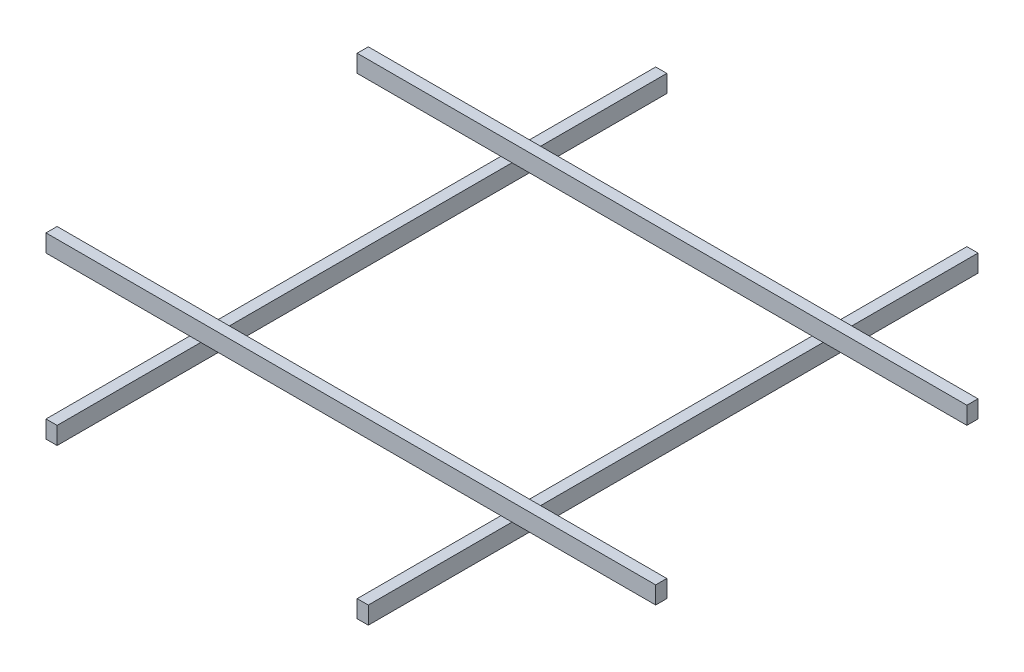
ISO-10303-21;
HEADER;
FILE_DESCRIPTION(('STEP AP214'),'2;1');
FILE_NAME('part.step','',(''),(''),'','','');
FILE_SCHEMA(('AUTOMOTIVE_DESIGN { 1 0 10303 214 1 1 1 1 }'));
ENDSEC;
DATA;
#1=APPLICATION_CONTEXT('core data for automotive mechanical design processes');
#2=APPLICATION_PROTOCOL_DEFINITION('international standard','automotive_design',2000,#1);
#3=PRODUCT_CONTEXT('',#1,'mechanical');
#4=PRODUCT('Part','Part','',(#3));
#5=PRODUCT_RELATED_PRODUCT_CATEGORY('part','',(#4));
#6=PRODUCT_DEFINITION_FORMATION('','',#4);
#7=PRODUCT_DEFINITION_CONTEXT('part definition',#1,'design');
#8=PRODUCT_DEFINITION('design','',#6,#7);
#9=PRODUCT_DEFINITION_SHAPE('','',#8);
#10=(LENGTH_UNIT() NAMED_UNIT(*) SI_UNIT(.MILLI.,.METRE.));
#11=(NAMED_UNIT(*) PLANE_ANGLE_UNIT() SI_UNIT($,.RADIAN.));
#12=(NAMED_UNIT(*) SI_UNIT($,.STERADIAN.) SOLID_ANGLE_UNIT());
#13=UNCERTAINTY_MEASURE_WITH_UNIT(LENGTH_MEASURE(1.E-05),#10,'distance_accuracy_value','');
#14=(GEOMETRIC_REPRESENTATION_CONTEXT(3) GLOBAL_UNCERTAINTY_ASSIGNED_CONTEXT((#13)) GLOBAL_UNIT_ASSIGNED_CONTEXT((#10,
#11,#12)) REPRESENTATION_CONTEXT('',''));
#15=CARTESIAN_POINT('',(0.,0.,0.));
#16=DIRECTION('',(0.,0.,1.));
#17=DIRECTION('',(1.,0.,0.));
#18=AXIS2_PLACEMENT_3D('',#15,#16,#17);
#19=CARTESIAN_POINT('',(4572.,209.55,-1238.25));
#20=DIRECTION('',(0.,0.,1.));
#21=DIRECTION('',(1.,0.,0.));
#22=AXIS2_PLACEMENT_3D('',#19,#20,#21);
#23=PLANE('',#22);
#24=DIRECTION('',(0.,1.,0.));
#25=VECTOR('',#24,1.);
#26=CARTESIAN_POINT('',(-304.8,209.55,-1238.25));
#27=LINE('',#26,#25);
#28=CARTESIAN_POINT('',(-304.8,69.85,-1238.25));
#29=VERTEX_POINT('',#28);
#30=CARTESIAN_POINT('',(-304.8,209.55,-1238.25));
#31=VERTEX_POINT('',#30);
#32=EDGE_CURVE('E130',#29,#31,#27,.T.);
#33=ORIENTED_EDGE('',*,*,#32,.T.);
#34=DIRECTION('',(-1.,0.,0.));
#35=VECTOR('',#34,1.);
#36=CARTESIAN_POINT('',(4572.,209.55,-1238.25));
#37=LINE('',#36,#35);
#38=CARTESIAN_POINT('',(4572.,209.55,-1238.25));
#39=VERTEX_POINT('',#38);
#40=EDGE_CURVE('E13',#39,#31,#37,.T.);
#41=ORIENTED_EDGE('',*,*,#40,.F.);
#42=DIRECTION('',(0.,1.,0.));
#43=VECTOR('',#42,1.);
#44=CARTESIAN_POINT('',(4572.,209.55,-1238.25));
#45=LINE('',#44,#43);
#46=CARTESIAN_POINT('',(4572.,69.85,-1238.25));
#47=VERTEX_POINT('',#46);
#48=EDGE_CURVE('E117',#47,#39,#45,.T.);
#49=ORIENTED_EDGE('',*,*,#48,.F.);
#50=DIRECTION('',(-1.,0.,0.));
#51=VECTOR('',#50,1.);
#52=CARTESIAN_POINT('',(4572.,69.85,-1238.25));
#53=LINE('',#52,#51);
#54=EDGE_CURVE('E126',#47,#29,#53,.T.);
#55=ORIENTED_EDGE('',*,*,#54,.T.);
#56=EDGE_LOOP('',(#33,#41,#49,#55));
#57=FACE_BOUND('',#56,.T.);
#58=ADVANCED_FACE('F65',(#57),#23,.F.);
#59=CARTESIAN_POINT('',(4572.,209.55,-1149.35));
#60=DIRECTION('',(0.,-1.,0.));
#61=DIRECTION('',(0.,0.,-1.));
#62=AXIS2_PLACEMENT_3D('',#59,#60,#61);
#63=PLANE('',#62);
#64=DIRECTION('',(0.,0.,1.));
#65=VECTOR('',#64,1.);
#66=CARTESIAN_POINT('',(-304.8,209.55,-1149.35));
#67=LINE('',#66,#65);
#68=CARTESIAN_POINT('',(-304.8,209.55,-1149.35));
#69=VERTEX_POINT('',#68);
#70=EDGE_CURVE('E121',#31,#69,#67,.T.);
#71=ORIENTED_EDGE('',*,*,#70,.T.);
#72=DIRECTION('',(-1.,0.,0.));
#73=VECTOR('',#72,1.);
#74=CARTESIAN_POINT('',(4572.,209.55,-1149.35));
#75=LINE('',#74,#73);
#76=CARTESIAN_POINT('',(4572.,209.55,-1149.35));
#77=VERTEX_POINT('',#76);
#78=EDGE_CURVE('E74',#77,#69,#75,.T.);
#79=ORIENTED_EDGE('',*,*,#78,.F.);
#80=DIRECTION('',(0.,0.,1.));
#81=VECTOR('',#80,1.);
#82=CARTESIAN_POINT('',(4572.,209.55,-1149.35));
#83=LINE('',#82,#81);
#84=EDGE_CURVE('E112',#39,#77,#83,.T.);
#85=ORIENTED_EDGE('',*,*,#84,.F.);
#86=ORIENTED_EDGE('',*,*,#40,.T.);
#87=EDGE_LOOP('',(#71,#79,#85,#86));
#88=FACE_BOUND('',#87,.T.);
#89=ADVANCED_FACE('F120',(#88),#63,.F.);
#90=CARTESIAN_POINT('',(4572.,209.55,-1149.35));
#91=DIRECTION('',(0.,0.,-1.));
#92=DIRECTION('',(-1.,0.,0.));
#93=AXIS2_PLACEMENT_3D('',#90,#91,#92);
#94=PLANE('',#93);
#95=DIRECTION('',(0.,-1.,0.));
#96=VECTOR('',#95,1.);
#97=CARTESIAN_POINT('',(-304.8,209.55,-1149.35));
#98=LINE('',#97,#96);
#99=CARTESIAN_POINT('',(-304.8,69.85,-1149.35));
#100=VERTEX_POINT('',#99);
#101=EDGE_CURVE('E99',#69,#100,#98,.T.);
#102=ORIENTED_EDGE('',*,*,#101,.T.);
#103=DIRECTION('',(-1.,0.,0.));
#104=VECTOR('',#103,1.);
#105=CARTESIAN_POINT('',(4572.,69.85,-1149.35));
#106=LINE('',#105,#104);
#107=CARTESIAN_POINT('',(4572.,69.85,-1149.35));
#108=VERTEX_POINT('',#107);
#109=EDGE_CURVE('E123',#108,#100,#106,.T.);
#110=ORIENTED_EDGE('',*,*,#109,.F.);
#111=DIRECTION('',(0.,-1.,0.));
#112=VECTOR('',#111,1.);
#113=CARTESIAN_POINT('',(4572.,209.55,-1149.35));
#114=LINE('',#113,#112);
#115=EDGE_CURVE('E115',#77,#108,#114,.T.);
#116=ORIENTED_EDGE('',*,*,#115,.F.);
#117=ORIENTED_EDGE('',*,*,#78,.T.);
#118=EDGE_LOOP('',(#102,#110,#116,#117));
#119=FACE_BOUND('',#118,.T.);
#120=ADVANCED_FACE('F124',(#119),#94,.F.);
#121=CARTESIAN_POINT('',(4572.,69.85,-1149.35));
#122=DIRECTION('',(0.,1.,0.));
#123=DIRECTION('',(0.,0.,1.));
#124=AXIS2_PLACEMENT_3D('',#121,#122,#123);
#125=PLANE('',#124);
#126=DIRECTION('',(0.,0.,-1.));
#127=VECTOR('',#126,1.);
#128=CARTESIAN_POINT('',(-304.8,69.85,-1149.35));
#129=LINE('',#128,#127);
#130=EDGE_CURVE('E105',#100,#29,#129,.T.);
#131=ORIENTED_EDGE('',*,*,#130,.T.);
#132=ORIENTED_EDGE('',*,*,#54,.F.);
#133=DIRECTION('',(0.,0.,-1.));
#134=VECTOR('',#133,1.);
#135=CARTESIAN_POINT('',(4572.,69.85,-1149.35));
#136=LINE('',#135,#134);
#137=EDGE_CURVE('E82',#108,#47,#136,.T.);
#138=ORIENTED_EDGE('',*,*,#137,.F.);
#139=ORIENTED_EDGE('',*,*,#109,.T.);
#140=EDGE_LOOP('',(#131,#132,#138,#139));
#141=FACE_BOUND('',#140,.T.);
#142=ADVANCED_FACE('F137',(#141),#125,.F.);
#143=CARTESIAN_POINT('',(4572.,139.7,-2082.8));
#144=DIRECTION('',(1.,0.,0.));
#145=DIRECTION('',(0.,0.,-1.));
#146=AXIS2_PLACEMENT_3D('',#143,#144,#145);
#147=PLANE('',#146);
#148=ORIENTED_EDGE('',*,*,#48,.T.);
#149=ORIENTED_EDGE('',*,*,#84,.T.);
#150=ORIENTED_EDGE('',*,*,#115,.T.);
#151=ORIENTED_EDGE('',*,*,#137,.T.);
#152=EDGE_LOOP('',(#148,#149,#150,#151));
#153=FACE_BOUND('',#152,.T.);
#154=ADVANCED_FACE('F113',(#153),#147,.T.);
#155=CARTESIAN_POINT('',(-304.8,139.7,-2082.8));
#156=DIRECTION('',(1.,0.,0.));
#157=DIRECTION('',(0.,0.,-1.));
#158=AXIS2_PLACEMENT_3D('',#155,#156,#157);
#159=PLANE('',#158);
#160=ORIENTED_EDGE('',*,*,#32,.F.);
#161=ORIENTED_EDGE('',*,*,#130,.F.);
#162=ORIENTED_EDGE('',*,*,#101,.F.);
#163=ORIENTED_EDGE('',*,*,#70,.F.);
#164=EDGE_LOOP('',(#160,#161,#162,#163));
#165=FACE_BOUND('',#164,.T.);
#166=ADVANCED_FACE('F140',(#165),#159,.F.);
#167=CLOSED_SHELL('',(#58,#89,#120,#142,#154,#166));
#168=MANIFOLD_SOLID_BREP('B2',#167);
#169=CARTESIAN_POINT('',(4572.,209.55,-3727.45));
#170=DIRECTION('',(0.,0.,1.));
#171=DIRECTION('',(1.,0.,0.));
#172=AXIS2_PLACEMENT_3D('',#169,#170,#171);
#173=PLANE('',#172);
#174=DIRECTION('',(0.,1.,0.));
#175=VECTOR('',#174,1.);
#176=CARTESIAN_POINT('',(-304.8,209.55,-3727.45));
#177=LINE('',#176,#175);
#178=CARTESIAN_POINT('',(-304.8,69.85,-3727.45));
#179=VERTEX_POINT('',#178);
#180=CARTESIAN_POINT('',(-304.8,209.55,-3727.45));
#181=VERTEX_POINT('',#180);
#182=EDGE_CURVE('E289',#179,#181,#177,.T.);
#183=ORIENTED_EDGE('',*,*,#182,.T.);
#184=DIRECTION('',(-1.,0.,0.));
#185=VECTOR('',#184,1.);
#186=CARTESIAN_POINT('',(4572.,209.55,-3727.45));
#187=LINE('',#186,#185);
#188=CARTESIAN_POINT('',(4572.,209.55,-3727.45));
#189=VERTEX_POINT('',#188);
#190=EDGE_CURVE('E63',#189,#181,#187,.T.);
#191=ORIENTED_EDGE('',*,*,#190,.F.);
#192=DIRECTION('',(0.,1.,0.));
#193=VECTOR('',#192,1.);
#194=CARTESIAN_POINT('',(4572.,209.55,-3727.45));
#195=LINE('',#194,#193);
#196=CARTESIAN_POINT('',(4572.,69.85,-3727.45));
#197=VERTEX_POINT('',#196);
#198=EDGE_CURVE('E276',#197,#189,#195,.T.);
#199=ORIENTED_EDGE('',*,*,#198,.F.);
#200=DIRECTION('',(-1.,0.,0.));
#201=VECTOR('',#200,1.);
#202=CARTESIAN_POINT('',(4572.,69.85,-3727.45));
#203=LINE('',#202,#201);
#204=EDGE_CURVE('E285',#197,#179,#203,.T.);
#205=ORIENTED_EDGE('',*,*,#204,.T.);
#206=EDGE_LOOP('',(#183,#191,#199,#205));
#207=FACE_BOUND('',#206,.T.);
#208=ADVANCED_FACE('F224',(#207),#173,.F.);
#209=CARTESIAN_POINT('',(4572.,209.55,-3638.55));
#210=DIRECTION('',(0.,-1.,0.));
#211=DIRECTION('',(0.,0.,-1.));
#212=AXIS2_PLACEMENT_3D('',#209,#210,#211);
#213=PLANE('',#212);
#214=DIRECTION('',(0.,0.,1.));
#215=VECTOR('',#214,1.);
#216=CARTESIAN_POINT('',(-304.8,209.55,-3638.55));
#217=LINE('',#216,#215);
#218=CARTESIAN_POINT('',(-304.8,209.55,-3638.55));
#219=VERTEX_POINT('',#218);
#220=EDGE_CURVE('E280',#181,#219,#217,.T.);
#221=ORIENTED_EDGE('',*,*,#220,.T.);
#222=DIRECTION('',(-1.,0.,0.));
#223=VECTOR('',#222,1.);
#224=CARTESIAN_POINT('',(4572.,209.55,-3638.55));
#225=LINE('',#224,#223);
#226=CARTESIAN_POINT('',(4572.,209.55,-3638.55));
#227=VERTEX_POINT('',#226);
#228=EDGE_CURVE('E233',#227,#219,#225,.T.);
#229=ORIENTED_EDGE('',*,*,#228,.F.);
#230=DIRECTION('',(0.,0.,1.));
#231=VECTOR('',#230,1.);
#232=CARTESIAN_POINT('',(4572.,209.55,-3638.55));
#233=LINE('',#232,#231);
#234=EDGE_CURVE('E271',#189,#227,#233,.T.);
#235=ORIENTED_EDGE('',*,*,#234,.F.);
#236=ORIENTED_EDGE('',*,*,#190,.T.);
#237=EDGE_LOOP('',(#221,#229,#235,#236));
#238=FACE_BOUND('',#237,.T.);
#239=ADVANCED_FACE('F279',(#238),#213,.F.);
#240=CARTESIAN_POINT('',(4572.,209.55,-3638.55));
#241=DIRECTION('',(0.,0.,-1.));
#242=DIRECTION('',(-1.,0.,0.));
#243=AXIS2_PLACEMENT_3D('',#240,#241,#242);
#244=PLANE('',#243);
#245=DIRECTION('',(0.,-1.,0.));
#246=VECTOR('',#245,1.);
#247=CARTESIAN_POINT('',(-304.8,209.55,-3638.55));
#248=LINE('',#247,#246);
#249=CARTESIAN_POINT('',(-304.8,69.85,-3638.55));
#250=VERTEX_POINT('',#249);
#251=EDGE_CURVE('E258',#219,#250,#248,.T.);
#252=ORIENTED_EDGE('',*,*,#251,.T.);
#253=DIRECTION('',(-1.,0.,0.));
#254=VECTOR('',#253,1.);
#255=CARTESIAN_POINT('',(4572.,69.85,-3638.55));
#256=LINE('',#255,#254);
#257=CARTESIAN_POINT('',(4572.,69.85,-3638.55));
#258=VERTEX_POINT('',#257);
#259=EDGE_CURVE('E282',#258,#250,#256,.T.);
#260=ORIENTED_EDGE('',*,*,#259,.F.);
#261=DIRECTION('',(0.,-1.,0.));
#262=VECTOR('',#261,1.);
#263=CARTESIAN_POINT('',(4572.,209.55,-3638.55));
#264=LINE('',#263,#262);
#265=EDGE_CURVE('E274',#227,#258,#264,.T.);
#266=ORIENTED_EDGE('',*,*,#265,.F.);
#267=ORIENTED_EDGE('',*,*,#228,.T.);
#268=EDGE_LOOP('',(#252,#260,#266,#267));
#269=FACE_BOUND('',#268,.T.);
#270=ADVANCED_FACE('F283',(#269),#244,.F.);
#271=CARTESIAN_POINT('',(4572.,69.85,-3638.55));
#272=DIRECTION('',(0.,1.,0.));
#273=DIRECTION('',(0.,0.,1.));
#274=AXIS2_PLACEMENT_3D('',#271,#272,#273);
#275=PLANE('',#274);
#276=DIRECTION('',(0.,0.,-1.));
#277=VECTOR('',#276,1.);
#278=CARTESIAN_POINT('',(-304.8,69.85,-3638.55));
#279=LINE('',#278,#277);
#280=EDGE_CURVE('E264',#250,#179,#279,.T.);
#281=ORIENTED_EDGE('',*,*,#280,.T.);
#282=ORIENTED_EDGE('',*,*,#204,.F.);
#283=DIRECTION('',(0.,0.,-1.));
#284=VECTOR('',#283,1.);
#285=CARTESIAN_POINT('',(4572.,69.85,-3638.55));
#286=LINE('',#285,#284);
#287=EDGE_CURVE('E241',#258,#197,#286,.T.);
#288=ORIENTED_EDGE('',*,*,#287,.F.);
#289=ORIENTED_EDGE('',*,*,#259,.T.);
#290=EDGE_LOOP('',(#281,#282,#288,#289));
#291=FACE_BOUND('',#290,.T.);
#292=ADVANCED_FACE('F298',(#291),#275,.F.);
#293=CARTESIAN_POINT('',(4572.,139.7,-4572.));
#294=DIRECTION('',(1.,0.,0.));
#295=DIRECTION('',(0.,0.,-1.));
#296=AXIS2_PLACEMENT_3D('',#293,#294,#295);
#297=PLANE('',#296);
#298=ORIENTED_EDGE('',*,*,#198,.T.);
#299=ORIENTED_EDGE('',*,*,#234,.T.);
#300=ORIENTED_EDGE('',*,*,#265,.T.);
#301=ORIENTED_EDGE('',*,*,#287,.T.);
#302=EDGE_LOOP('',(#298,#299,#300,#301));
#303=FACE_BOUND('',#302,.T.);
#304=ADVANCED_FACE('F272',(#303),#297,.T.);
#305=CARTESIAN_POINT('',(-304.8,139.7,-4572.));
#306=DIRECTION('',(1.,0.,0.));
#307=DIRECTION('',(0.,0.,-1.));
#308=AXIS2_PLACEMENT_3D('',#305,#306,#307);
#309=PLANE('',#308);
#310=ORIENTED_EDGE('',*,*,#182,.F.);
#311=ORIENTED_EDGE('',*,*,#280,.F.);
#312=ORIENTED_EDGE('',*,*,#251,.F.);
#313=ORIENTED_EDGE('',*,*,#220,.F.);
#314=EDGE_LOOP('',(#310,#311,#312,#313));
#315=FACE_BOUND('',#314,.T.);
#316=ADVANCED_FACE('F301',(#315),#309,.F.);
#317=CLOSED_SHELL('',(#208,#239,#270,#292,#304,#316));
#318=MANIFOLD_SOLID_BREP('B7',#317);
#319=CARTESIAN_POINT('',(3333.75,69.85,-4876.8));
#320=DIRECTION('',(1.,0.,0.));
#321=DIRECTION('',(0.,0.,-1.));
#322=AXIS2_PLACEMENT_3D('',#319,#320,#321);
#323=PLANE('',#322);
#324=DIRECTION('',(0.,1.,0.));
#325=VECTOR('',#324,1.);
#326=CARTESIAN_POINT('',(3333.75,69.85,1.63306650666299E-13));
#327=LINE('',#326,#325);
#328=CARTESIAN_POINT('',(3333.75,-69.85,1.63306650666299E-13));
#329=VERTEX_POINT('',#328);
#330=CARTESIAN_POINT('',(3333.75,69.85,1.63306650666299E-13));
#331=VERTEX_POINT('',#330);
#332=EDGE_CURVE('E447',#329,#331,#327,.T.);
#333=ORIENTED_EDGE('',*,*,#332,.T.);
#334=DIRECTION('',(0.,0.,1.));
#335=VECTOR('',#334,1.);
#336=CARTESIAN_POINT('',(3333.75,69.85,-4876.8));
#337=LINE('',#336,#335);
#338=CARTESIAN_POINT('',(3333.75,69.85,-4876.8));
#339=VERTEX_POINT('',#338);
#340=EDGE_CURVE('E222',#339,#331,#337,.T.);
#341=ORIENTED_EDGE('',*,*,#340,.F.);
#342=DIRECTION('',(0.,1.,0.));
#343=VECTOR('',#342,1.);
#344=CARTESIAN_POINT('',(3333.75,69.85,-4876.8));
#345=LINE('',#344,#343);
#346=CARTESIAN_POINT('',(3333.75,-69.85,-4876.8));
#347=VERTEX_POINT('',#346);
#348=EDGE_CURVE('E435',#347,#339,#345,.T.);
#349=ORIENTED_EDGE('',*,*,#348,.F.);
#350=DIRECTION('',(0.,0.,1.));
#351=VECTOR('',#350,1.);
#352=CARTESIAN_POINT('',(3333.75,-69.85,-4876.8));
#353=LINE('',#352,#351);
#354=EDGE_CURVE('E443',#347,#329,#353,.T.);
#355=ORIENTED_EDGE('',*,*,#354,.T.);
#356=EDGE_LOOP('',(#333,#341,#349,#355));
#357=FACE_BOUND('',#356,.T.);
#358=ADVANCED_FACE('F384',(#357),#323,.F.);
#359=CARTESIAN_POINT('',(3422.65,69.85,-4876.8));
#360=DIRECTION('',(0.,-1.,0.));
#361=DIRECTION('',(0.,0.,-1.));
#362=AXIS2_PLACEMENT_3D('',#359,#360,#361);
#363=PLANE('',#362);
#364=DIRECTION('',(1.,0.,0.));
#365=VECTOR('',#364,1.);
#366=CARTESIAN_POINT('',(3422.65,69.85,1.63306650666299E-13));
#367=LINE('',#366,#365);
#368=CARTESIAN_POINT('',(3422.65,69.85,1.63306650666299E-13));
#369=VERTEX_POINT('',#368);
#370=EDGE_CURVE('E439',#331,#369,#367,.T.);
#371=ORIENTED_EDGE('',*,*,#370,.T.);
#372=DIRECTION('',(0.,0.,1.));
#373=VECTOR('',#372,1.);
#374=CARTESIAN_POINT('',(3422.65,69.85,-4876.8));
#375=LINE('',#374,#373);
#376=CARTESIAN_POINT('',(3422.65,69.85,-4876.8));
#377=VERTEX_POINT('',#376);
#378=EDGE_CURVE('E392',#377,#369,#375,.T.);
#379=ORIENTED_EDGE('',*,*,#378,.F.);
#380=DIRECTION('',(1.,0.,0.));
#381=VECTOR('',#380,1.);
#382=CARTESIAN_POINT('',(3422.65,69.85,-4876.8));
#383=LINE('',#382,#381);
#384=EDGE_CURVE('E430',#339,#377,#383,.T.);
#385=ORIENTED_EDGE('',*,*,#384,.F.);
#386=ORIENTED_EDGE('',*,*,#340,.T.);
#387=EDGE_LOOP('',(#371,#379,#385,#386));
#388=FACE_BOUND('',#387,.T.);
#389=ADVANCED_FACE('F438',(#388),#363,.F.);
#390=CARTESIAN_POINT('',(3422.65,69.85,-4876.8));
#391=DIRECTION('',(-1.,0.,0.));
#392=DIRECTION('',(0.,0.,1.));
#393=AXIS2_PLACEMENT_3D('',#390,#391,#392);
#394=PLANE('',#393);
#395=DIRECTION('',(0.,-1.,0.));
#396=VECTOR('',#395,1.);
#397=CARTESIAN_POINT('',(3422.65,69.85,1.63306650666299E-13));
#398=LINE('',#397,#396);
#399=CARTESIAN_POINT('',(3422.65,-69.85,1.63306650666299E-13));
#400=VERTEX_POINT('',#399);
#401=EDGE_CURVE('E417',#369,#400,#398,.T.);
#402=ORIENTED_EDGE('',*,*,#401,.T.);
#403=DIRECTION('',(0.,0.,1.));
#404=VECTOR('',#403,1.);
#405=CARTESIAN_POINT('',(3422.65,-69.85,-4876.8));
#406=LINE('',#405,#404);
#407=CARTESIAN_POINT('',(3422.65,-69.85,-4876.8));
#408=VERTEX_POINT('',#407);
#409=EDGE_CURVE('E440',#408,#400,#406,.T.);
#410=ORIENTED_EDGE('',*,*,#409,.F.);
#411=DIRECTION('',(0.,-1.,0.));
#412=VECTOR('',#411,1.);
#413=CARTESIAN_POINT('',(3422.65,69.85,-4876.8));
#414=LINE('',#413,#412);
#415=EDGE_CURVE('E433',#377,#408,#414,.T.);
#416=ORIENTED_EDGE('',*,*,#415,.F.);
#417=ORIENTED_EDGE('',*,*,#378,.T.);
#418=EDGE_LOOP('',(#402,#410,#416,#417));
#419=FACE_BOUND('',#418,.T.);
#420=ADVANCED_FACE('F441',(#419),#394,.F.);
#421=CARTESIAN_POINT('',(3422.65,-69.85,-4876.8));
#422=DIRECTION('',(0.,1.,0.));
#423=DIRECTION('',(0.,0.,1.));
#424=AXIS2_PLACEMENT_3D('',#421,#422,#423);
#425=PLANE('',#424);
#426=DIRECTION('',(-1.,0.,0.));
#427=VECTOR('',#426,1.);
#428=CARTESIAN_POINT('',(3422.65,-69.85,1.63306650666299E-13));
#429=LINE('',#428,#427);
#430=EDGE_CURVE('E423',#400,#329,#429,.T.);
#431=ORIENTED_EDGE('',*,*,#430,.T.);
#432=ORIENTED_EDGE('',*,*,#354,.F.);
#433=DIRECTION('',(-1.,0.,0.));
#434=VECTOR('',#433,1.);
#435=CARTESIAN_POINT('',(3422.65,-69.85,-4876.8));
#436=LINE('',#435,#434);
#437=EDGE_CURVE('E400',#408,#347,#436,.T.);
#438=ORIENTED_EDGE('',*,*,#437,.F.);
#439=ORIENTED_EDGE('',*,*,#409,.T.);
#440=EDGE_LOOP('',(#431,#432,#438,#439));
#441=FACE_BOUND('',#440,.T.);
#442=ADVANCED_FACE('F454',(#441),#425,.F.);
#443=CARTESIAN_POINT('',(2489.2,0.,-4876.8));
#444=DIRECTION('',(0.,0.,-1.));
#445=DIRECTION('',(-1.,0.,0.));
#446=AXIS2_PLACEMENT_3D('',#443,#444,#445);
#447=PLANE('',#446);
#448=ORIENTED_EDGE('',*,*,#348,.T.);
#449=ORIENTED_EDGE('',*,*,#384,.T.);
#450=ORIENTED_EDGE('',*,*,#415,.T.);
#451=ORIENTED_EDGE('',*,*,#437,.T.);
#452=EDGE_LOOP('',(#448,#449,#450,#451));
#453=FACE_BOUND('',#452,.T.);
#454=ADVANCED_FACE('F431',(#453),#447,.T.);
#455=CARTESIAN_POINT('',(2489.2,0.,1.63306650666299E-13));
#456=DIRECTION('',(0.,0.,-1.));
#457=DIRECTION('',(-1.,0.,0.));
#458=AXIS2_PLACEMENT_3D('',#455,#456,#457);
#459=PLANE('',#458);
#460=ORIENTED_EDGE('',*,*,#332,.F.);
#461=ORIENTED_EDGE('',*,*,#430,.F.);
#462=ORIENTED_EDGE('',*,*,#401,.F.);
#463=ORIENTED_EDGE('',*,*,#370,.F.);
#464=EDGE_LOOP('',(#460,#461,#462,#463));
#465=FACE_BOUND('',#464,.T.);
#466=ADVANCED_FACE('F457',(#465),#459,.F.);
#467=CLOSED_SHELL('',(#358,#389,#420,#442,#454,#466));
#468=MANIFOLD_SOLID_BREP('B57',#467);
#469=CARTESIAN_POINT('',(844.55,69.85,-4876.8));
#470=DIRECTION('',(1.,0.,0.));
#471=DIRECTION('',(0.,0.,-1.));
#472=AXIS2_PLACEMENT_3D('',#469,#470,#471);
#473=PLANE('',#472);
#474=DIRECTION('',(0.,1.,0.));
#475=VECTOR('',#474,1.);
#476=CARTESIAN_POINT('',(844.55,69.85,8.88178419700125E-13));
#477=LINE('',#476,#475);
#478=CARTESIAN_POINT('',(844.55,-69.85,8.88178419700125E-13));
#479=VERTEX_POINT('',#478);
#480=CARTESIAN_POINT('',(844.55,69.85,8.88178419700125E-13));
#481=VERTEX_POINT('',#480);
#482=EDGE_CURVE('E594',#479,#481,#477,.T.);
#483=ORIENTED_EDGE('',*,*,#482,.T.);
#484=DIRECTION('',(0.,0.,1.));
#485=VECTOR('',#484,1.);
#486=CARTESIAN_POINT('',(844.55,69.85,-4876.8));
#487=LINE('',#486,#485);
#488=CARTESIAN_POINT('',(844.55,69.85,-4876.8));
#489=VERTEX_POINT('',#488);
#490=EDGE_CURVE('E382',#489,#481,#487,.T.);
#491=ORIENTED_EDGE('',*,*,#490,.F.);
#492=DIRECTION('',(0.,1.,0.));
#493=VECTOR('',#492,1.);
#494=CARTESIAN_POINT('',(844.55,69.85,-4876.8));
#495=LINE('',#494,#493);
#496=CARTESIAN_POINT('',(844.55,-69.85,-4876.8));
#497=VERTEX_POINT('',#496);
#498=EDGE_CURVE('E582',#497,#489,#495,.T.);
#499=ORIENTED_EDGE('',*,*,#498,.F.);
#500=DIRECTION('',(0.,0.,1.));
#501=VECTOR('',#500,1.);
#502=CARTESIAN_POINT('',(844.55,-69.85,-4876.8));
#503=LINE('',#502,#501);
#504=EDGE_CURVE('E590',#497,#479,#503,.T.);
#505=ORIENTED_EDGE('',*,*,#504,.T.);
#506=EDGE_LOOP('',(#483,#491,#499,#505));
#507=FACE_BOUND('',#506,.T.);
#508=ADVANCED_FACE('F531',(#507),#473,.F.);
#509=CARTESIAN_POINT('',(933.45,69.85,-4876.8));
#510=DIRECTION('',(0.,-1.,0.));
#511=DIRECTION('',(0.,0.,-1.));
#512=AXIS2_PLACEMENT_3D('',#509,#510,#511);
#513=PLANE('',#512);
#514=DIRECTION('',(1.,0.,0.));
#515=VECTOR('',#514,1.);
#516=CARTESIAN_POINT('',(933.45,69.85,8.88178419700125E-13));
#517=LINE('',#516,#515);
#518=CARTESIAN_POINT('',(933.45,69.85,8.88178419700125E-13));
#519=VERTEX_POINT('',#518);
#520=EDGE_CURVE('E586',#481,#519,#517,.T.);
#521=ORIENTED_EDGE('',*,*,#520,.T.);
#522=DIRECTION('',(0.,0.,1.));
#523=VECTOR('',#522,1.);
#524=CARTESIAN_POINT('',(933.45,69.85,-4876.8));
#525=LINE('',#524,#523);
#526=CARTESIAN_POINT('',(933.45,69.85,-4876.8));
#527=VERTEX_POINT('',#526);
#528=EDGE_CURVE('E539',#527,#519,#525,.T.);
#529=ORIENTED_EDGE('',*,*,#528,.F.);
#530=DIRECTION('',(1.,0.,0.));
#531=VECTOR('',#530,1.);
#532=CARTESIAN_POINT('',(933.45,69.85,-4876.8));
#533=LINE('',#532,#531);
#534=EDGE_CURVE('E577',#489,#527,#533,.T.);
#535=ORIENTED_EDGE('',*,*,#534,.F.);
#536=ORIENTED_EDGE('',*,*,#490,.T.);
#537=EDGE_LOOP('',(#521,#529,#535,#536));
#538=FACE_BOUND('',#537,.T.);
#539=ADVANCED_FACE('F585',(#538),#513,.F.);
#540=CARTESIAN_POINT('',(933.45,69.85,-4876.8));
#541=DIRECTION('',(-1.,0.,0.));
#542=DIRECTION('',(0.,0.,1.));
#543=AXIS2_PLACEMENT_3D('',#540,#541,#542);
#544=PLANE('',#543);
#545=DIRECTION('',(0.,-1.,0.));
#546=VECTOR('',#545,1.);
#547=CARTESIAN_POINT('',(933.45,69.85,8.88178419700125E-13));
#548=LINE('',#547,#546);
#549=CARTESIAN_POINT('',(933.45,-69.85,8.88178419700125E-13));
#550=VERTEX_POINT('',#549);
#551=EDGE_CURVE('E564',#519,#550,#548,.T.);
#552=ORIENTED_EDGE('',*,*,#551,.T.);
#553=DIRECTION('',(0.,0.,1.));
#554=VECTOR('',#553,1.);
#555=CARTESIAN_POINT('',(933.45,-69.85,-4876.8));
#556=LINE('',#555,#554);
#557=CARTESIAN_POINT('',(933.45,-69.85,-4876.8));
#558=VERTEX_POINT('',#557);
#559=EDGE_CURVE('E587',#558,#550,#556,.T.);
#560=ORIENTED_EDGE('',*,*,#559,.F.);
#561=DIRECTION('',(0.,-1.,0.));
#562=VECTOR('',#561,1.);
#563=CARTESIAN_POINT('',(933.45,69.85,-4876.8));
#564=LINE('',#563,#562);
#565=EDGE_CURVE('E580',#527,#558,#564,.T.);
#566=ORIENTED_EDGE('',*,*,#565,.F.);
#567=ORIENTED_EDGE('',*,*,#528,.T.);
#568=EDGE_LOOP('',(#552,#560,#566,#567));
#569=FACE_BOUND('',#568,.T.);
#570=ADVANCED_FACE('F588',(#569),#544,.F.);
#571=CARTESIAN_POINT('',(933.45,-69.85,-4876.8));
#572=DIRECTION('',(0.,1.,0.));
#573=DIRECTION('',(0.,0.,1.));
#574=AXIS2_PLACEMENT_3D('',#571,#572,#573);
#575=PLANE('',#574);
#576=DIRECTION('',(-1.,0.,0.));
#577=VECTOR('',#576,1.);
#578=CARTESIAN_POINT('',(933.45,-69.85,8.88178419700125E-13));
#579=LINE('',#578,#577);
#580=EDGE_CURVE('E570',#550,#479,#579,.T.);
#581=ORIENTED_EDGE('',*,*,#580,.T.);
#582=ORIENTED_EDGE('',*,*,#504,.F.);
#583=DIRECTION('',(-1.,0.,0.));
#584=VECTOR('',#583,1.);
#585=CARTESIAN_POINT('',(933.45,-69.85,-4876.8));
#586=LINE('',#585,#584);
#587=EDGE_CURVE('E547',#558,#497,#586,.T.);
#588=ORIENTED_EDGE('',*,*,#587,.F.);
#589=ORIENTED_EDGE('',*,*,#559,.T.);
#590=EDGE_LOOP('',(#581,#582,#588,#589));
#591=FACE_BOUND('',#590,.T.);
#592=ADVANCED_FACE('F601',(#591),#575,.F.);
#593=CARTESIAN_POINT('',(0.,0.,-4876.8));
#594=DIRECTION('',(0.,0.,-1.));
#595=DIRECTION('',(-1.,0.,0.));
#596=AXIS2_PLACEMENT_3D('',#593,#594,#595);
#597=PLANE('',#596);
#598=ORIENTED_EDGE('',*,*,#498,.T.);
#599=ORIENTED_EDGE('',*,*,#534,.T.);
#600=ORIENTED_EDGE('',*,*,#565,.T.);
#601=ORIENTED_EDGE('',*,*,#587,.T.);
#602=EDGE_LOOP('',(#598,#599,#600,#601));
#603=FACE_BOUND('',#602,.T.);
#604=ADVANCED_FACE('F578',(#603),#597,.T.);
#605=CARTESIAN_POINT('',(0.,0.,8.88178419700125E-13));
#606=DIRECTION('',(0.,0.,-1.));
#607=DIRECTION('',(-1.,0.,0.));
#608=AXIS2_PLACEMENT_3D('',#605,#606,#607);
#609=PLANE('',#608);
#610=ORIENTED_EDGE('',*,*,#482,.F.);
#611=ORIENTED_EDGE('',*,*,#580,.F.);
#612=ORIENTED_EDGE('',*,*,#551,.F.);
#613=ORIENTED_EDGE('',*,*,#520,.F.);
#614=EDGE_LOOP('',(#610,#611,#612,#613));
#615=FACE_BOUND('',#614,.T.);
#616=ADVANCED_FACE('F604',(#615),#609,.F.);
#617=CLOSED_SHELL('',(#508,#539,#570,#592,#604,#616));
#618=MANIFOLD_SOLID_BREP('B216',#617);
#619=ADVANCED_BREP_SHAPE_REPRESENTATION('',(#18,#168,#318,#468,#618),#14);
#620=SHAPE_DEFINITION_REPRESENTATION(#9,#619);
ENDSEC;
END-ISO-10303-21;
